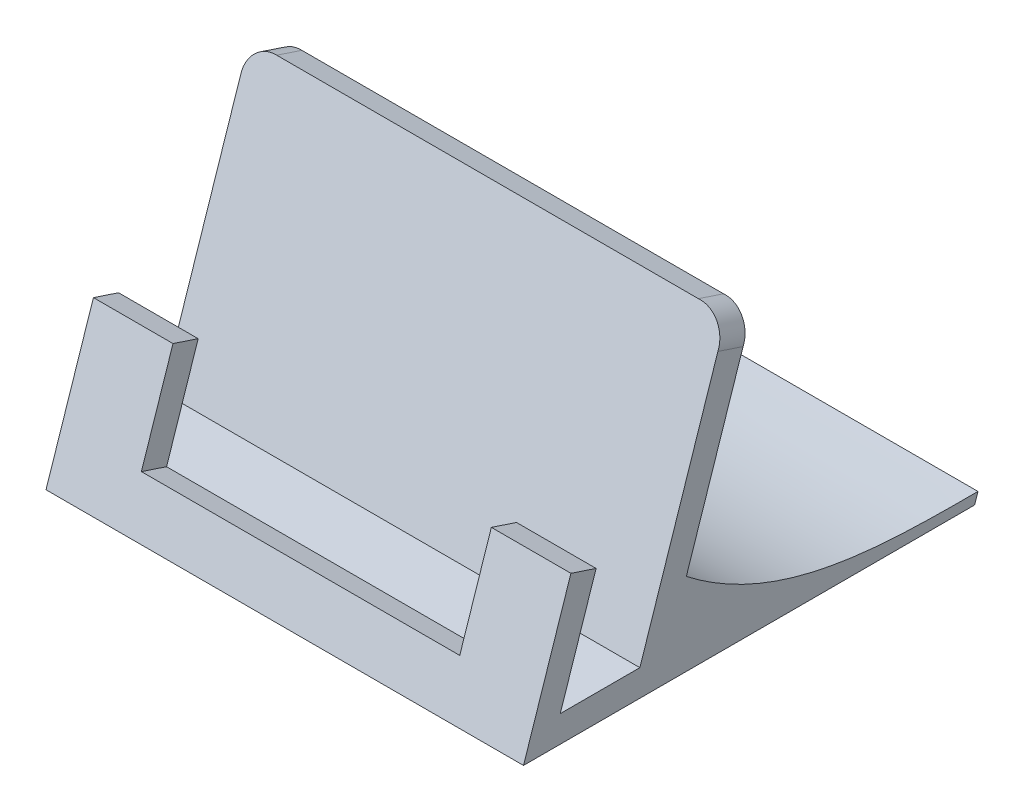
ISO-10303-21;
HEADER;
FILE_DESCRIPTION(('STEP AP214'),'2;1');
FILE_NAME('part.step','',(''),(''),'','','');
FILE_SCHEMA(('AUTOMOTIVE_DESIGN { 1 0 10303 214 1 1 1 1 }'));
ENDSEC;
DATA;
#1=APPLICATION_CONTEXT('core data for automotive mechanical design processes');
#2=APPLICATION_PROTOCOL_DEFINITION('international standard','automotive_design',2000,#1);
#3=PRODUCT_CONTEXT('',#1,'mechanical');
#4=PRODUCT('Part','Part','',(#3));
#5=PRODUCT_RELATED_PRODUCT_CATEGORY('part','',(#4));
#6=PRODUCT_DEFINITION_FORMATION('','',#4);
#7=PRODUCT_DEFINITION_CONTEXT('part definition',#1,'design');
#8=PRODUCT_DEFINITION('design','',#6,#7);
#9=PRODUCT_DEFINITION_SHAPE('','',#8);
#10=(LENGTH_UNIT() NAMED_UNIT(*) SI_UNIT(.MILLI.,.METRE.));
#11=(NAMED_UNIT(*) PLANE_ANGLE_UNIT() SI_UNIT($,.RADIAN.));
#12=(NAMED_UNIT(*) SI_UNIT($,.STERADIAN.) SOLID_ANGLE_UNIT());
#13=UNCERTAINTY_MEASURE_WITH_UNIT(LENGTH_MEASURE(1.E-05),#10,'distance_accuracy_value','');
#14=(GEOMETRIC_REPRESENTATION_CONTEXT(3) GLOBAL_UNCERTAINTY_ASSIGNED_CONTEXT((#13)) GLOBAL_UNIT_ASSIGNED_CONTEXT((#10,
#11,#12)) REPRESENTATION_CONTEXT('',''));
#15=CARTESIAN_POINT('',(0.,0.,0.));
#16=DIRECTION('',(0.,0.,1.));
#17=DIRECTION('',(1.,0.,0.));
#18=AXIS2_PLACEMENT_3D('',#15,#16,#17);
#19=CARTESIAN_POINT('',(-441.444866920152,25.,349.733840304183));
#20=DIRECTION('',(1.,0.,0.));
#21=DIRECTION('',(0.,0.,-1.));
#22=AXIS2_PLACEMENT_3D('',#19,#20,#21);
#23=PLANE('',#22);
#24=DIRECTION('',(0.,3.42548369672828E-06,-0.999999999994133));
#25=VECTOR('',#24,1.);
#26=CARTESIAN_POINT('',(-441.444866920152,3.10228056000864,349.733765293902));
#27=LINE('',#26,#25);
#28=CARTESIAN_POINT('',(-441.444866920152,3.10199384400964,433.434645048575));
#29=VERTEX_POINT('',#28);
#30=CARTESIAN_POINT('',(-441.444866920152,3.10204522573535,418.43479969466));
#31=VERTEX_POINT('',#30);
#32=EDGE_CURVE('E217',#29,#31,#27,.T.);
#33=ORIENTED_EDGE('',*,*,#32,.T.);
#34=DIRECTION('',(0.,-0.948977387132326,0.315344127440966));
#35=VECTOR('',#34,1.);
#36=CARTESIAN_POINT('',(-441.444866920152,5.,417.804111439778));
#37=LINE('',#36,#35);
#38=CARTESIAN_POINT('',(-441.444866920152,47.556984794626,403.662472852231));
#39=VERTEX_POINT('',#38);
#40=EDGE_CURVE('E317',#39,#31,#37,.T.);
#41=ORIENTED_EDGE('',*,*,#40,.F.);
#42=DIRECTION('',(0.,0.315344127440966,0.948977387132325));
#43=VECTOR('',#42,1.);
#44=CARTESIAN_POINT('',(-441.444866920152,45.9802641574228,398.917585916569));
#45=LINE('',#44,#43);
#46=CARTESIAN_POINT('',(-441.444866920152,45.9802641574211,398.91758591657));
#47=VERTEX_POINT('',#46);
#48=EDGE_CURVE('E418',#39,#47,#45,.F.);
#49=ORIENTED_EDGE('',*,*,#48,.T.);
#50=DIRECTION('',(0.,0.948977387132325,-0.315344127440966));
#51=VECTOR('',#50,1.);
#52=CARTESIAN_POINT('',(-441.444866920152,50.8721487194115,397.292018132068));
#53=LINE('',#52,#51);
#54=CARTESIAN_POINT('',(-441.444866920152,13.6122713544121,409.673433828104));
#55=VERTEX_POINT('',#54);
#56=EDGE_CURVE('E312',#55,#47,#53,.T.);
#57=ORIENTED_EDGE('',*,*,#56,.F.);
#58=CARTESIAN_POINT('',(-441.444866920152,0.,352.286663655326));
#59=CARTESIAN_POINT('',(-441.444866920152,0.00659214130960388,371.968229932027));
#60=CARTESIAN_POINT('',(-441.444866920152,-0.348112277879768,391.693864933798));
#61=CARTESIAN_POINT('',(-441.444866920152,13.6122713544121,409.673433828104));
#62=B_SPLINE_CURVE_WITH_KNOTS('',3,(#58,#59,#60,#61),.UNSPECIFIED.,.F.,.F.,(4,4),(0.,1.),.UNSPECIFIED.);
#63=CARTESIAN_POINT('',(-441.444866920152,0.,354.703637066143));
#64=VERTEX_POINT('',#63);
#65=EDGE_CURVE('E221',#64,#55,#62,.T.);
#66=ORIENTED_EDGE('',*,*,#65,.F.);
#67=DIRECTION('',(0.,-0.949003077995214,0.315266804398449));
#68=VECTOR('',#67,1.);
#69=CARTESIAN_POINT('',(-441.444866920152,106.123485976628,319.448522439799));
#70=LINE('',#69,#68);
#71=CARTESIAN_POINT('',(-441.444866920152,-1.89800615599041,355.33417067494));
#72=VERTEX_POINT('',#71);
#73=EDGE_CURVE('E197',#64,#72,#70,.T.);
#74=ORIENTED_EDGE('',*,*,#73,.T.);
#75=DIRECTION('',(0.,0.,-1.));
#76=VECTOR('',#75,1.);
#77=CARTESIAN_POINT('',(-441.444866920152,-1.89800615599041,0.));
#78=LINE('',#77,#76);
#79=CARTESIAN_POINT('',(-441.444866920152,-1.89800615599042,440.36437391298));
#80=VERTEX_POINT('',#79);
#81=EDGE_CURVE('E193',#80,#72,#78,.T.);
#82=ORIENTED_EDGE('',*,*,#81,.F.);
#83=DIRECTION('',(0.,0.949003077995214,-0.315266804398451));
#84=VECTOR('',#83,1.);
#85=CARTESIAN_POINT('',(-441.444866920152,49.4421961498557,423.308726894082));
#86=LINE('',#85,#84);
#87=CARTESIAN_POINT('',(-441.444866920152,25.,431.428630033831));
#88=VERTEX_POINT('',#87);
#89=EDGE_CURVE('E174',#80,#88,#86,.T.);
#90=ORIENTED_EDGE('',*,*,#89,.T.);
#91=DIRECTION('',(0.,-0.31526680439844,-0.949003077995217));
#92=VECTOR('',#91,1.);
#93=CARTESIAN_POINT('',(-441.444866920152,0.557803850145012,357.853743443932));
#94=LINE('',#93,#92);
#95=CARTESIAN_POINT('',(-441.444866920152,23.4236659780078,426.683614643855));
#96=VERTEX_POINT('',#95);
#97=EDGE_CURVE('E187',#88,#96,#94,.T.);
#98=ORIENTED_EDGE('',*,*,#97,.T.);
#99=DIRECTION('',(0.,-0.949003077995217,0.315266804398439));
#100=VECTOR('',#99,1.);
#101=CARTESIAN_POINT('',(-441.444866920152,47.8658621278627,418.563711504106));
#102=LINE('',#101,#100);
#103=EDGE_CURVE('E322',#96,#29,#102,.T.);
#104=ORIENTED_EDGE('',*,*,#103,.T.);
#105=EDGE_LOOP('',(#33,#41,#49,#57,#66,#74,#82,#90,#98,#104));
#106=FACE_BOUND('',#105,.T.);
#107=ADVANCED_FACE('F36',(#106),#23,.F.);
#108=CARTESIAN_POINT('',(-351.444866920152,25.,349.733840304183));
#109=DIRECTION('',(-1.,0.,0.));
#110=DIRECTION('',(0.,0.,1.));
#111=AXIS2_PLACEMENT_3D('',#108,#109,#110);
#112=PLANE('',#111);
#113=DIRECTION('',(0.,-0.948977387132326,0.315344127440966));
#114=VECTOR('',#113,1.);
#115=CARTESIAN_POINT('',(-351.444866920152,5.,417.804111439778));
#116=LINE('',#115,#114);
#117=CARTESIAN_POINT('',(-351.444866920152,47.358446185361,403.728447010679));
#118=VERTEX_POINT('',#117);
#119=CARTESIAN_POINT('',(-351.444866920152,3.10204522573535,418.43479969466));
#120=VERTEX_POINT('',#119);
#121=EDGE_CURVE('E308',#118,#120,#116,.T.);
#122=ORIENTED_EDGE('',*,*,#121,.T.);
#123=DIRECTION('',(0.,3.42548369672828E-06,-0.999999999994133));
#124=VECTOR('',#123,1.);
#125=CARTESIAN_POINT('',(-351.444866920152,3.10204522573535,418.43479969466));
#126=LINE('',#125,#124);
#127=CARTESIAN_POINT('',(-351.444866920152,3.10199384400964,433.434645048575));
#128=VERTEX_POINT('',#127);
#129=EDGE_CURVE('E209',#128,#120,#126,.T.);
#130=ORIENTED_EDGE('',*,*,#129,.F.);
#131=DIRECTION('',(0.,-0.949003077995217,0.315266804398439));
#132=VECTOR('',#131,1.);
#133=CARTESIAN_POINT('',(-351.444866920152,5.,432.804111439778));
#134=LINE('',#133,#132);
#135=CARTESIAN_POINT('',(-351.444866920152,23.4236659780078,426.683614643855));
#136=VERTEX_POINT('',#135);
#137=EDGE_CURVE('E324',#136,#128,#134,.T.);
#138=ORIENTED_EDGE('',*,*,#137,.F.);
#139=DIRECTION('',(0.,-0.31526680439844,-0.949003077995217));
#140=VECTOR('',#139,1.);
#141=CARTESIAN_POINT('',(-351.444866920152,25.,431.428630033831));
#142=LINE('',#141,#140);
#143=CARTESIAN_POINT('',(-351.444866920152,25.,431.428630033831));
#144=VERTEX_POINT('',#143);
#145=EDGE_CURVE('E331',#144,#136,#142,.T.);
#146=ORIENTED_EDGE('',*,*,#145,.F.);
#147=DIRECTION('',(0.,0.949003077995213,-0.315266804398451));
#148=VECTOR('',#147,1.);
#149=CARTESIAN_POINT('',(-351.444866920152,0.,439.733840304183));
#150=LINE('',#149,#148);
#151=CARTESIAN_POINT('',(-351.444866920152,-1.89800615599042,440.36437391298));
#152=VERTEX_POINT('',#151);
#153=EDGE_CURVE('E334',#152,#144,#150,.T.);
#154=ORIENTED_EDGE('',*,*,#153,.F.);
#155=DIRECTION('',(0.,0.,-1.));
#156=VECTOR('',#155,1.);
#157=CARTESIAN_POINT('',(-351.444866920152,-1.89800615599041,0.));
#158=LINE('',#157,#156);
#159=CARTESIAN_POINT('',(-351.444866920152,-1.89800615599041,355.33417067494));
#160=VERTEX_POINT('',#159);
#161=EDGE_CURVE('E195',#152,#160,#158,.T.);
#162=ORIENTED_EDGE('',*,*,#161,.T.);
#163=DIRECTION('',(0.,-0.949003077995214,0.315266804398449));
#164=VECTOR('',#163,1.);
#165=CARTESIAN_POINT('',(-351.444866920152,106.123485976628,319.448522439799));
#166=LINE('',#165,#164);
#167=CARTESIAN_POINT('',(-351.444866920152,0.,354.703637066143));
#168=VERTEX_POINT('',#167);
#169=EDGE_CURVE('E202',#168,#160,#166,.T.);
#170=ORIENTED_EDGE('',*,*,#169,.F.);
#171=CARTESIAN_POINT('',(-351.444866920152,0.,352.286663655326));
#172=CARTESIAN_POINT('',(-351.444866920152,0.00659214130960388,371.968229932027));
#173=CARTESIAN_POINT('',(-351.444866920152,-0.348112277879768,391.693864933798));
#174=CARTESIAN_POINT('',(-351.444866920152,13.6122713544121,409.673433828104));
#175=B_SPLINE_CURVE_WITH_KNOTS('',3,(#171,#172,#173,#174),.UNSPECIFIED.,.F.,.F.,(4,4),(0.,1.),.UNSPECIFIED.);
#176=CARTESIAN_POINT('',(-351.444866920152,13.6122713544121,409.673433828104));
#177=VERTEX_POINT('',#176);
#178=EDGE_CURVE('E434',#168,#177,#175,.T.);
#179=ORIENTED_EDGE('',*,*,#178,.T.);
#180=DIRECTION('',(0.,0.948977387132325,-0.315344127440966));
#181=VECTOR('',#180,1.);
#182=CARTESIAN_POINT('',(-351.444866920152,50.8721487194115,397.292018132068));
#183=LINE('',#182,#181);
#184=CARTESIAN_POINT('',(-351.444866920152,45.7817255481562,398.983560075017));
#185=VERTEX_POINT('',#184);
#186=EDGE_CURVE('E313',#177,#185,#183,.T.);
#187=ORIENTED_EDGE('',*,*,#186,.T.);
#188=DIRECTION('',(0.,0.315344127440966,0.948977387132325));
#189=VECTOR('',#188,1.);
#190=CARTESIAN_POINT('',(-351.444866920152,45.7817255481562,398.983560075017));
#191=LINE('',#190,#189);
#192=EDGE_CURVE('E51',#185,#118,#191,.T.);
#193=ORIENTED_EDGE('',*,*,#192,.T.);
#194=EDGE_LOOP('',(#122,#130,#138,#146,#154,#162,#170,#179,#187,#193));
#195=FACE_BOUND('',#194,.T.);
#196=ADVANCED_FACE('F300',(#195),#112,.F.);
#197=CARTESIAN_POINT('',(-465.444866920152,25.,431.428630033831));
#198=DIRECTION('',(0.,-0.949003077995217,0.31526680439844));
#199=DIRECTION('',(0.,-0.31526680439844,-0.949003077995217));
#200=AXIS2_PLACEMENT_3D('',#197,#198,#199);
#201=PLANE('',#200);
#202=DIRECTION('',(0.,0.315266804398451,0.949003077995214));
#203=VECTOR('',#202,1.);
#204=CARTESIAN_POINT('',(-366.444866920152,22.7931323692108,424.785608487865));
#205=LINE('',#204,#203);
#206=CARTESIAN_POINT('',(-366.444866920152,23.4236659780077,426.683614643855));
#207=VERTEX_POINT('',#206);
#208=CARTESIAN_POINT('',(-366.444866920152,25.,431.428630033831));
#209=VERTEX_POINT('',#208);
#210=EDGE_CURVE('E374',#207,#209,#205,.T.);
#211=ORIENTED_EDGE('',*,*,#210,.T.);
#212=DIRECTION('',(1.,0.,0.));
#213=VECTOR('',#212,1.);
#214=CARTESIAN_POINT('',(-465.444866920152,25.,431.428630033831));
#215=LINE('',#214,#213);
#216=EDGE_CURVE('E330',#209,#144,#215,.T.);
#217=ORIENTED_EDGE('',*,*,#216,.T.);
#218=ORIENTED_EDGE('',*,*,#145,.T.);
#219=DIRECTION('',(1.,0.,0.));
#220=VECTOR('',#219,1.);
#221=CARTESIAN_POINT('',(-465.444866920152,23.4236659780078,426.683614643855));
#222=LINE('',#221,#220);
#223=EDGE_CURVE('E327',#207,#136,#222,.T.);
#224=ORIENTED_EDGE('',*,*,#223,.F.);
#225=EDGE_LOOP('',(#211,#217,#218,#224));
#226=FACE_BOUND('',#225,.T.);
#227=ADVANCED_FACE('F298',(#226),#201,.F.);
#228=CARTESIAN_POINT('',(-465.444866920152,0.,439.733840304183));
#229=DIRECTION('',(0.,-0.315266804398451,-0.949003077995213));
#230=DIRECTION('',(0.,0.949003077995213,-0.315266804398451));
#231=AXIS2_PLACEMENT_3D('',#228,#229,#230);
#232=PLANE('',#231);
#233=DIRECTION('',(-1.,0.,0.));
#234=VECTOR('',#233,1.);
#235=CARTESIAN_POINT('',(-1.27409095702096E-13,7.07598732368962,437.38313780044));
#236=LINE('',#235,#234);
#237=CARTESIAN_POINT('',(-366.444866920152,7.07598732368955,437.383137800439));
#238=VERTEX_POINT('',#237);
#239=CARTESIAN_POINT('',(-426.444866920152,7.07598732368956,437.383137800439));
#240=VERTEX_POINT('',#239);
#241=EDGE_CURVE('E400',#238,#240,#236,.T.);
#242=ORIENTED_EDGE('',*,*,#241,.T.);
#243=DIRECTION('',(0.,-0.949003077995213,0.315266804398451));
#244=VECTOR('',#243,1.);
#245=CARTESIAN_POINT('',(-426.444866920152,25.,431.428630033831));
#246=LINE('',#245,#244);
#247=CARTESIAN_POINT('',(-426.444866920152,25.,431.428630033831));
#248=VERTEX_POINT('',#247);
#249=EDGE_CURVE('E372',#248,#240,#246,.T.);
#250=ORIENTED_EDGE('',*,*,#249,.F.);
#251=EDGE_CURVE('E183',#88,#248,#215,.T.);
#252=ORIENTED_EDGE('',*,*,#251,.F.);
#253=ORIENTED_EDGE('',*,*,#89,.F.);
#254=DIRECTION('',(1.,0.,0.));
#255=VECTOR('',#254,1.);
#256=CARTESIAN_POINT('',(-441.444866920152,-1.89800615599042,440.36437391298));
#257=LINE('',#256,#255);
#258=EDGE_CURVE('E179',#80,#152,#257,.T.);
#259=ORIENTED_EDGE('',*,*,#258,.T.);
#260=ORIENTED_EDGE('',*,*,#153,.T.);
#261=ORIENTED_EDGE('',*,*,#216,.F.);
#262=DIRECTION('',(0.,-0.949003077995213,0.315266804398451));
#263=VECTOR('',#262,1.);
#264=CARTESIAN_POINT('',(-366.444866920152,25.,431.428630033831));
#265=LINE('',#264,#263);
#266=EDGE_CURVE('E367',#209,#238,#265,.T.);
#267=ORIENTED_EDGE('',*,*,#266,.T.);
#268=EDGE_LOOP('',(#242,#250,#252,#253,#259,#260,#261,#267));
#269=FACE_BOUND('',#268,.T.);
#270=ADVANCED_FACE('F177',(#269),#232,.F.);
#271=CARTESIAN_POINT('',(-465.444866920152,5.,432.804111439778));
#272=DIRECTION('',(0.,0.315266804398439,0.949003077995217));
#273=DIRECTION('',(0.,-0.949003077995217,0.315266804398439));
#274=AXIS2_PLACEMENT_3D('',#271,#272,#273);
#275=PLANE('',#274);
#276=ORIENTED_EDGE('',*,*,#137,.T.);
#277=DIRECTION('',(1.,0.,0.));
#278=VECTOR('',#277,1.);
#279=CARTESIAN_POINT('',(-461.444866920152,3.10199384400964,433.434645048575));
#280=LINE('',#279,#278);
#281=EDGE_CURVE('E213',#29,#128,#280,.T.);
#282=ORIENTED_EDGE('',*,*,#281,.F.);
#283=ORIENTED_EDGE('',*,*,#103,.F.);
#284=CARTESIAN_POINT('',(-426.444866920152,23.4236659780077,426.683614643855));
#285=VERTEX_POINT('',#284);
#286=EDGE_CURVE('E188',#96,#285,#222,.T.);
#287=ORIENTED_EDGE('',*,*,#286,.T.);
#288=DIRECTION('',(0.,-0.949003077995217,0.315266804398439));
#289=VECTOR('',#288,1.);
#290=CARTESIAN_POINT('',(-426.444866920152,5.,432.804111439778));
#291=LINE('',#290,#289);
#292=CARTESIAN_POINT('',(-426.444866920152,5.49965330169725,432.638122410463));
#293=VERTEX_POINT('',#292);
#294=EDGE_CURVE('E382',#285,#293,#291,.T.);
#295=ORIENTED_EDGE('',*,*,#294,.T.);
#296=DIRECTION('',(1.,0.,0.));
#297=VECTOR('',#296,1.);
#298=CARTESIAN_POINT('',(-1.27409095702096E-13,5.49965330169725,432.638122410463));
#299=LINE('',#298,#297);
#300=CARTESIAN_POINT('',(-366.444866920152,5.49965330169725,432.638122410463));
#301=VERTEX_POINT('',#300);
#302=EDGE_CURVE('E11',#293,#301,#299,.T.);
#303=ORIENTED_EDGE('',*,*,#302,.T.);
#304=DIRECTION('',(0.,-0.949003077995217,0.315266804398439));
#305=VECTOR('',#304,1.);
#306=CARTESIAN_POINT('',(-366.444866920152,5.,432.804111439778));
#307=LINE('',#306,#305);
#308=EDGE_CURVE('E384',#207,#301,#307,.T.);
#309=ORIENTED_EDGE('',*,*,#308,.F.);
#310=ORIENTED_EDGE('',*,*,#223,.T.);
#311=EDGE_LOOP('',(#276,#282,#283,#287,#295,#303,#309,#310));
#312=FACE_BOUND('',#311,.T.);
#313=ADVANCED_FACE('F291',(#312),#275,.F.);
#314=ORIENTED_EDGE('',*,*,#251,.T.);
#315=DIRECTION('',(0.,0.315266804398451,0.949003077995214));
#316=VECTOR('',#315,1.);
#317=CARTESIAN_POINT('',(-426.444866920152,22.7931323692108,424.785608487865));
#318=LINE('',#317,#316);
#319=EDGE_CURVE('E380',#285,#248,#318,.T.);
#320=ORIENTED_EDGE('',*,*,#319,.F.);
#321=ORIENTED_EDGE('',*,*,#286,.F.);
#322=ORIENTED_EDGE('',*,*,#97,.F.);
#323=EDGE_LOOP('',(#314,#320,#321,#322));
#324=FACE_BOUND('',#323,.T.);
#325=ADVANCED_FACE('F284',(#324),#201,.F.);
#326=CARTESIAN_POINT('',(-441.444866920152,5.,417.804111439778));
#327=DIRECTION('',(0.,0.315344127440966,0.948977387132325));
#328=DIRECTION('',(0.,-0.948977387132326,0.315344127440966));
#329=AXIS2_PLACEMENT_3D('',#326,#327,#328);
#330=PLANE('',#329);
#331=ORIENTED_EDGE('',*,*,#40,.T.);
#332=DIRECTION('',(1.,0.,0.));
#333=VECTOR('',#332,1.);
#334=CARTESIAN_POINT('',(-461.444866920152,3.10204522573535,418.43479969466));
#335=LINE('',#334,#333);
#336=EDGE_CURVE('E214',#31,#120,#335,.T.);
#337=ORIENTED_EDGE('',*,*,#336,.T.);
#338=ORIENTED_EDGE('',*,*,#121,.F.);
#339=CARTESIAN_POINT('',(-356.444866920152,47.7039824209547,403.613625704935));
#340=DIRECTION('',(0.,0.315344127440966,0.948977387132325));
#341=DIRECTION('',(0.,-0.948977387132325,0.315344127440966));
#342=AXIS2_PLACEMENT_3D('',#339,#340,#341);
#343=CIRCLE('',#342,5.01324039143957);
#344=CARTESIAN_POINT('',(-356.808981218637,52.4488693566163,402.03690506773));
#345=VERTEX_POINT('',#344);
#346=EDGE_CURVE('E432',#118,#345,#343,.T.);
#347=ORIENTED_EDGE('',*,*,#346,.T.);
#348=DIRECTION('',(1.,0.,0.));
#349=VECTOR('',#348,1.);
#350=CARTESIAN_POINT('',(-441.444866920152,52.4488693566163,402.03690506773));
#351=LINE('',#350,#349);
#352=CARTESIAN_POINT('',(-436.28996583576,52.4488693566163,402.03690506773));
#353=VERTEX_POINT('',#352);
#354=EDGE_CURVE('E59',#353,#345,#351,.T.);
#355=ORIENTED_EDGE('',*,*,#354,.F.);
#356=CARTESIAN_POINT('',(-436.444866920152,47.7039824209547,403.613625704935));
#357=DIRECTION('',(0.,0.315344127440966,0.948977387132325));
#358=DIRECTION('',(0.,-0.948977387132325,0.315344127440966));
#359=AXIS2_PLACEMENT_3D('',#356,#357,#358);
#360=CIRCLE('',#359,5.00239885914202);
#361=EDGE_CURVE('E424',#353,#39,#360,.T.);
#362=ORIENTED_EDGE('',*,*,#361,.T.);
#363=EDGE_LOOP('',(#331,#337,#338,#347,#355,#362));
#364=FACE_BOUND('',#363,.T.);
#365=ADVANCED_FACE('F280',(#364),#330,.T.);
#366=CARTESIAN_POINT('',(-441.444866920152,52.4488693566163,402.03690506773));
#367=DIRECTION('',(0.,0.948977387132325,-0.315344127440967));
#368=DIRECTION('',(0.,0.315344127440967,0.948977387132325));
#369=AXIS2_PLACEMENT_3D('',#366,#367,#368);
#370=PLANE('',#369);
#371=DIRECTION('',(0.,0.315344127440966,0.948977387132325));
#372=VECTOR('',#371,1.);
#373=CARTESIAN_POINT('',(-356.808981218637,50.8721487194115,397.292018132068));
#374=LINE('',#373,#372);
#375=CARTESIAN_POINT('',(-356.808981218637,50.8721487194115,397.292018132068));
#376=VERTEX_POINT('',#375);
#377=EDGE_CURVE('E429',#376,#345,#374,.T.);
#378=ORIENTED_EDGE('',*,*,#377,.F.);
#379=DIRECTION('',(1.,0.,0.));
#380=VECTOR('',#379,1.);
#381=CARTESIAN_POINT('',(-441.444866920152,50.8721487194115,397.292018132068));
#382=LINE('',#381,#380);
#383=CARTESIAN_POINT('',(-436.28996583576,50.8721487194115,397.292018132068));
#384=VERTEX_POINT('',#383);
#385=EDGE_CURVE('E389',#384,#376,#382,.T.);
#386=ORIENTED_EDGE('',*,*,#385,.F.);
#387=DIRECTION('',(0.,0.315344127440966,0.948977387132325));
#388=VECTOR('',#387,1.);
#389=CARTESIAN_POINT('',(-436.28996583576,50.8721487194115,397.292018132068));
#390=LINE('',#389,#388);
#391=EDGE_CURVE('E420',#353,#384,#390,.F.);
#392=ORIENTED_EDGE('',*,*,#391,.F.);
#393=ORIENTED_EDGE('',*,*,#354,.T.);
#394=EDGE_LOOP('',(#378,#386,#392,#393));
#395=FACE_BOUND('',#394,.T.);
#396=ADVANCED_FACE('F283',(#395),#370,.T.);
#397=CARTESIAN_POINT('',(-441.444866920152,50.8721487194115,397.292018132068));
#398=DIRECTION('',(0.,-0.315344127440966,-0.948977387132325));
#399=DIRECTION('',(0.,0.948977387132326,-0.315344127440966));
#400=AXIS2_PLACEMENT_3D('',#397,#398,#399);
#401=PLANE('',#400);
#402=ORIENTED_EDGE('',*,*,#385,.T.);
#403=CARTESIAN_POINT('',(-356.444866920152,46.1272617837499,398.868738769273));
#404=DIRECTION('',(0.,0.315344127440966,0.948977387132325));
#405=DIRECTION('',(0.,-0.948977387132325,0.315344127440966));
#406=AXIS2_PLACEMENT_3D('',#403,#404,#405);
#407=CIRCLE('',#406,5.01324039143957);
#408=EDGE_CURVE('E431',#185,#376,#407,.T.);
#409=ORIENTED_EDGE('',*,*,#408,.F.);
#410=ORIENTED_EDGE('',*,*,#186,.F.);
#411=DIRECTION('',(-1.,0.,0.));
#412=VECTOR('',#411,1.);
#413=CARTESIAN_POINT('',(-336.444866920152,13.6122713544121,409.673433828104));
#414=LINE('',#413,#412);
#415=EDGE_CURVE('E412',#177,#55,#414,.T.);
#416=ORIENTED_EDGE('',*,*,#415,.T.);
#417=ORIENTED_EDGE('',*,*,#56,.T.);
#418=CARTESIAN_POINT('',(-436.444866920152,46.1272617837499,398.868738769273));
#419=DIRECTION('',(0.,0.315344127440966,0.948977387132325));
#420=DIRECTION('',(0.,-0.948977387132325,0.315344127440966));
#421=AXIS2_PLACEMENT_3D('',#418,#419,#420);
#422=CIRCLE('',#421,5.00239885914202);
#423=EDGE_CURVE('E423',#384,#47,#422,.T.);
#424=ORIENTED_EDGE('',*,*,#423,.F.);
#425=EDGE_LOOP('',(#402,#409,#410,#416,#417,#424));
#426=FACE_BOUND('',#425,.T.);
#427=ADVANCED_FACE('F278',(#426),#401,.T.);
#428=CARTESIAN_POINT('',(-366.444866920152,22.7931323692108,424.785608487865));
#429=DIRECTION('',(-1.,0.,0.));
#430=DIRECTION('',(0.,0.,1.));
#431=AXIS2_PLACEMENT_3D('',#428,#429,#430);
#432=PLANE('',#431);
#433=DIRECTION('',(0.,0.315266804398451,0.949003077995213));
#434=VECTOR('',#433,1.);
#435=CARTESIAN_POINT('',(-366.444866920152,5.18438649729887,431.689119332468));
#436=LINE('',#435,#434);
#437=EDGE_CURVE('E399',#301,#238,#436,.T.);
#438=ORIENTED_EDGE('',*,*,#437,.T.);
#439=ORIENTED_EDGE('',*,*,#266,.F.);
#440=ORIENTED_EDGE('',*,*,#210,.F.);
#441=ORIENTED_EDGE('',*,*,#308,.T.);
#442=EDGE_LOOP('',(#438,#439,#440,#441));
#443=FACE_BOUND('',#442,.T.);
#444=ADVANCED_FACE('F274',(#443),#432,.T.);
#445=CARTESIAN_POINT('',(-426.444866920152,22.7931323692108,424.785608487865));
#446=DIRECTION('',(-1.,0.,0.));
#447=DIRECTION('',(0.,0.,1.));
#448=AXIS2_PLACEMENT_3D('',#445,#446,#447);
#449=PLANE('',#448);
#450=ORIENTED_EDGE('',*,*,#249,.T.);
#451=DIRECTION('',(0.,0.315266804398451,0.949003077995213));
#452=VECTOR('',#451,1.);
#453=CARTESIAN_POINT('',(-426.444866920152,5.18438649729887,431.689119332468));
#454=LINE('',#453,#452);
#455=EDGE_CURVE('E401',#293,#240,#454,.T.);
#456=ORIENTED_EDGE('',*,*,#455,.F.);
#457=ORIENTED_EDGE('',*,*,#294,.F.);
#458=ORIENTED_EDGE('',*,*,#319,.T.);
#459=EDGE_LOOP('',(#450,#456,#457,#458));
#460=FACE_BOUND('',#459,.T.);
#461=ADVANCED_FACE('F257',(#460),#449,.F.);
#462=CARTESIAN_POINT('',(-1.27409095702096E-13,5.18438649729893,431.689119332468));
#463=DIRECTION('',(0.,0.949003077995213,-0.315266804398451));
#464=DIRECTION('',(0.,0.315266804398451,0.949003077995214));
#465=AXIS2_PLACEMENT_3D('',#462,#463,#464);
#466=PLANE('',#465);
#467=ORIENTED_EDGE('',*,*,#302,.F.);
#468=ORIENTED_EDGE('',*,*,#455,.T.);
#469=ORIENTED_EDGE('',*,*,#241,.F.);
#470=ORIENTED_EDGE('',*,*,#437,.F.);
#471=EDGE_LOOP('',(#467,#468,#469,#470));
#472=FACE_BOUND('',#471,.T.);
#473=ADVANCED_FACE('F247',(#472),#466,.T.);
#474=CARTESIAN_POINT('',(-436.444866920152,46.1272617837499,398.868738769273));
#475=DIRECTION('',(0.,0.315344127440966,0.948977387132325));
#476=DIRECTION('',(0.,-0.948977387132325,0.315344127440966));
#477=AXIS2_PLACEMENT_3D('',#474,#475,#476);
#478=CYLINDRICAL_SURFACE('',#477,5.00239885914202);
#479=ORIENTED_EDGE('',*,*,#48,.F.);
#480=ORIENTED_EDGE('',*,*,#361,.F.);
#481=ORIENTED_EDGE('',*,*,#391,.T.);
#482=ORIENTED_EDGE('',*,*,#423,.T.);
#483=EDGE_LOOP('',(#479,#480,#481,#482));
#484=FACE_BOUND('',#483,.T.);
#485=ADVANCED_FACE('F243',(#484),#478,.T.);
#486=CARTESIAN_POINT('',(-356.444866920152,46.1272617837499,398.868738769273));
#487=DIRECTION('',(0.,0.315344127440966,0.948977387132325));
#488=DIRECTION('',(0.,-0.948977387132325,0.315344127440966));
#489=AXIS2_PLACEMENT_3D('',#486,#487,#488);
#490=CYLINDRICAL_SURFACE('',#489,5.01324039143957);
#491=ORIENTED_EDGE('',*,*,#192,.F.);
#492=ORIENTED_EDGE('',*,*,#408,.T.);
#493=ORIENTED_EDGE('',*,*,#377,.T.);
#494=ORIENTED_EDGE('',*,*,#346,.F.);
#495=EDGE_LOOP('',(#491,#492,#493,#494));
#496=FACE_BOUND('',#495,.T.);
#497=ADVANCED_FACE('F238',(#496),#490,.T.);
#498=CARTESIAN_POINT('',(-331.444866920152,0.,352.286663655326));
#499=CARTESIAN_POINT('',(-331.444866920152,0.00659214130960388,371.968229932027));
#500=CARTESIAN_POINT('',(-331.444866920152,-0.348112277879768,391.693864933798));
#501=CARTESIAN_POINT('',(-331.444866920152,13.6122713544121,409.673433828104));
#502=B_SPLINE_CURVE_WITH_KNOTS('',3,(#498,#499,#500,#501),.UNSPECIFIED.,.F.,.F.,(4,4),(0.,1.),.UNSPECIFIED.);
#503=DIRECTION('',(-1.,0.,0.));
#504=VECTOR('',#503,1.);
#505=SURFACE_OF_LINEAR_EXTRUSION('',#502,#504);
#506=DIRECTION('',(1.,0.,0.));
#507=VECTOR('',#506,1.);
#508=CARTESIAN_POINT('',(-456.444866920152,0.,354.703637066143));
#509=LINE('',#508,#507);
#510=EDGE_CURVE('E416',#64,#168,#509,.T.);
#511=ORIENTED_EDGE('',*,*,#510,.F.);
#512=ORIENTED_EDGE('',*,*,#65,.T.);
#513=ORIENTED_EDGE('',*,*,#415,.F.);
#514=ORIENTED_EDGE('',*,*,#178,.F.);
#515=EDGE_LOOP('',(#511,#512,#513,#514));
#516=FACE_BOUND('',#515,.T.);
#517=ADVANCED_FACE('F233',(#516),#505,.F.);
#518=CARTESIAN_POINT('',(-461.444866920152,3.10204522573535,418.43479969466));
#519=DIRECTION('',(0.,-0.999999999994133,-3.42548369672828E-06));
#520=DIRECTION('',(0.,3.42548369672828E-06,-0.999999999994133));
#521=AXIS2_PLACEMENT_3D('',#518,#519,#520);
#522=PLANE('',#521);
#523=ORIENTED_EDGE('',*,*,#281,.T.);
#524=ORIENTED_EDGE('',*,*,#129,.T.);
#525=ORIENTED_EDGE('',*,*,#336,.F.);
#526=ORIENTED_EDGE('',*,*,#32,.F.);
#527=EDGE_LOOP('',(#523,#524,#525,#526));
#528=FACE_BOUND('',#527,.T.);
#529=ADVANCED_FACE('F237',(#528),#522,.F.);
#530=CARTESIAN_POINT('',(-441.444866920152,106.123485976628,319.448522439799));
#531=DIRECTION('',(0.,0.315266804398449,0.949003077995214));
#532=DIRECTION('',(0.,-0.949003077995214,0.315266804398449));
#533=AXIS2_PLACEMENT_3D('',#530,#531,#532);
#534=PLANE('',#533);
#535=ORIENTED_EDGE('',*,*,#169,.T.);
#536=DIRECTION('',(1.,0.,0.));
#537=VECTOR('',#536,1.);
#538=CARTESIAN_POINT('',(-441.444866920152,-1.89800615599041,355.33417067494));
#539=LINE('',#538,#537);
#540=EDGE_CURVE('E196',#72,#160,#539,.T.);
#541=ORIENTED_EDGE('',*,*,#540,.F.);
#542=ORIENTED_EDGE('',*,*,#73,.F.);
#543=ORIENTED_EDGE('',*,*,#510,.T.);
#544=EDGE_LOOP('',(#535,#541,#542,#543));
#545=FACE_BOUND('',#544,.T.);
#546=ADVANCED_FACE('F453',(#545),#534,.F.);
#547=CARTESIAN_POINT('',(-441.444866920152,-1.89800615599041,0.));
#548=DIRECTION('',(0.,-1.,0.));
#549=DIRECTION('',(0.,0.,-1.));
#550=AXIS2_PLACEMENT_3D('',#547,#548,#549);
#551=PLANE('',#550);
#552=ORIENTED_EDGE('',*,*,#161,.F.);
#553=ORIENTED_EDGE('',*,*,#258,.F.);
#554=ORIENTED_EDGE('',*,*,#81,.T.);
#555=ORIENTED_EDGE('',*,*,#540,.T.);
#556=EDGE_LOOP('',(#552,#553,#554,#555));
#557=FACE_BOUND('',#556,.T.);
#558=ADVANCED_FACE('F192',(#557),#551,.T.);
#559=CLOSED_SHELL('',(#107,#196,#227,#270,#313,#325,#365,#396,#427,#444,#461,#473,#485,#497,
#517,#529,#546,#558));
#560=CARTESIAN_POINT('',(0.,1.00000000000002,0.));
#561=DIRECTION('',(0.,1.,0.));
#562=DIRECTION('',(0.,0.,1.));
#563=AXIS2_PLACEMENT_3D('',#560,#561,#562);
#564=PLANE('',#563);
#565=DIRECTION('',(1.,0.,0.));
#566=VECTOR('',#565,1.);
#567=CARTESIAN_POINT('',(-1.39329358078945E-13,1.00000000000002,433.079207720968));
#568=LINE('',#567,#566);
#569=CARTESIAN_POINT('',(-426.444866920152,0.999999999999973,433.079207720968));
#570=VERTEX_POINT('',#569);
#571=CARTESIAN_POINT('',(-366.444866920152,1.00000000000001,433.079207720968));
#572=VERTEX_POINT('',#571);
#573=EDGE_CURVE('E352',#570,#572,#568,.T.);
#574=ORIENTED_EDGE('',*,*,#573,.F.);
#575=DIRECTION('',(0.,0.,1.));
#576=VECTOR('',#575,1.);
#577=CARTESIAN_POINT('',(-426.444866920152,1.00000000000002,430.696636715645));
#578=LINE('',#577,#576);
#579=CARTESIAN_POINT('',(-426.444866920152,1.00000000000001,432.025470358901));
#580=VERTEX_POINT('',#579);
#581=EDGE_CURVE('E355',#580,#570,#578,.T.);
#582=ORIENTED_EDGE('',*,*,#581,.F.);
#583=DIRECTION('',(-1.,0.,0.));
#584=VECTOR('',#583,1.);
#585=CARTESIAN_POINT('',(0.,1.00000000000003,432.025470358901));
#586=LINE('',#585,#584);
#587=CARTESIAN_POINT('',(-366.444866920152,1.00000000000001,432.025470358901));
#588=VERTEX_POINT('',#587);
#589=EDGE_CURVE('E354',#588,#580,#586,.T.);
#590=ORIENTED_EDGE('',*,*,#589,.F.);
#591=DIRECTION('',(0.,0.,-1.));
#592=VECTOR('',#591,1.);
#593=CARTESIAN_POINT('',(-366.444866920152,1.00000000000002,437.294437067301));
#594=LINE('',#593,#592);
#595=EDGE_CURVE('E344',#572,#588,#594,.T.);
#596=ORIENTED_EDGE('',*,*,#595,.F.);
#597=EDGE_LOOP('',(#574,#582,#590,#596));
#598=FACE_BOUND('',#597,.T.);
#599=ADVANCED_FACE('F259',(#598),#564,.F.);
#600=CARTESIAN_POINT('',(-1.27409095702096E-13,0.242244214214643,432.277203204282));
#601=DIRECTION('',(0.,-0.949003077995214,0.315266804398451));
#602=DIRECTION('',(0.,-0.315266804398451,-0.949003077995213));
#603=AXIS2_PLACEMENT_3D('',#600,#601,#602);
#604=PLANE('',#603);
#605=DIRECTION('',(-1.,0.,0.));
#606=VECTOR('',#605,1.);
#607=CARTESIAN_POINT('',(-1.27409095702096E-13,0.557511018613096,433.226206282277));
#608=LINE('',#607,#606);
#609=CARTESIAN_POINT('',(-366.444866920152,0.55751101861305,433.226206282277));
#610=VERTEX_POINT('',#609);
#611=CARTESIAN_POINT('',(-426.444866920152,0.55751101861305,433.226206282277));
#612=VERTEX_POINT('',#611);
#613=EDGE_CURVE('E402',#610,#612,#608,.T.);
#614=ORIENTED_EDGE('',*,*,#613,.F.);
#615=DIRECTION('',(0.,0.315266804398451,0.949003077995214));
#616=VECTOR('',#615,1.);
#617=CARTESIAN_POINT('',(-366.444866920152,0.242244214214608,432.277203204282));
#618=LINE('',#617,#616);
#619=CARTESIAN_POINT('',(-366.444866920152,0.242244214214608,432.277203204282));
#620=VERTEX_POINT('',#619);
#621=EDGE_CURVE('E347',#620,#610,#618,.T.);
#622=ORIENTED_EDGE('',*,*,#621,.F.);
#623=DIRECTION('',(1.,0.,0.));
#624=VECTOR('',#623,1.);
#625=CARTESIAN_POINT('',(-1.27409095702096E-13,0.242244214214643,432.277203204282));
#626=LINE('',#625,#624);
#627=CARTESIAN_POINT('',(-426.444866920152,0.242244214214605,432.277203204282));
#628=VERTEX_POINT('',#627);
#629=EDGE_CURVE('E357',#628,#620,#626,.T.);
#630=ORIENTED_EDGE('',*,*,#629,.F.);
#631=DIRECTION('',(0.,0.315266804398451,0.949003077995214));
#632=VECTOR('',#631,1.);
#633=CARTESIAN_POINT('',(-426.444866920152,0.242244214214605,432.277203204282));
#634=LINE('',#633,#632);
#635=EDGE_CURVE('E364',#628,#612,#634,.T.);
#636=ORIENTED_EDGE('',*,*,#635,.T.);
#637=EDGE_LOOP('',(#614,#622,#630,#636));
#638=FACE_BOUND('',#637,.T.);
#639=ADVANCED_FACE('F262',(#638),#604,.F.);
#640=DIRECTION('',(0.,0.949003077995214,-0.315266804398451));
#641=VECTOR('',#640,1.);
#642=CARTESIAN_POINT('',(-426.444866920152,129.672000891817,390.333286788431));
#643=LINE('',#642,#641);
#644=EDGE_CURVE('E405',#612,#570,#643,.T.);
#645=ORIENTED_EDGE('',*,*,#644,.F.);
#646=ORIENTED_EDGE('',*,*,#635,.F.);
#647=DIRECTION('',(0.,-0.949003077995213,0.315266804398451));
#648=VECTOR('',#647,1.);
#649=CARTESIAN_POINT('',(-426.444866920152,22.7931323692108,424.785608487865));
#650=LINE('',#649,#648);
#651=EDGE_CURVE('E371',#580,#628,#650,.T.);
#652=ORIENTED_EDGE('',*,*,#651,.F.);
#653=ORIENTED_EDGE('',*,*,#581,.T.);
#654=EDGE_LOOP('',(#645,#646,#652,#653));
#655=FACE_BOUND('',#654,.T.);
#656=ADVANCED_FACE('F266',(#655),#449,.F.);
#657=ORIENTED_EDGE('',*,*,#621,.T.);
#658=DIRECTION('',(0.,0.949003077995214,-0.315266804398451));
#659=VECTOR('',#658,1.);
#660=CARTESIAN_POINT('',(-366.444866920152,23.1083991736093,425.73461156586));
#661=LINE('',#660,#659);
#662=EDGE_CURVE('E44',#610,#572,#661,.T.);
#663=ORIENTED_EDGE('',*,*,#662,.T.);
#664=ORIENTED_EDGE('',*,*,#595,.T.);
#665=DIRECTION('',(0.,-0.949003077995213,0.315266804398451));
#666=VECTOR('',#665,1.);
#667=CARTESIAN_POINT('',(-366.444866920152,22.7931323692108,424.785608487865));
#668=LINE('',#667,#666);
#669=EDGE_CURVE('E369',#588,#620,#668,.T.);
#670=ORIENTED_EDGE('',*,*,#669,.T.);
#671=EDGE_LOOP('',(#657,#663,#664,#670));
#672=FACE_BOUND('',#671,.T.);
#673=ADVANCED_FACE('F270',(#672),#432,.T.);
#674=CARTESIAN_POINT('',(0.,129.356734087419,389.384283710436));
#675=DIRECTION('',(0.,0.315266804398451,0.949003077995213));
#676=DIRECTION('',(0.,-0.949003077995213,0.315266804398451));
#677=AXIS2_PLACEMENT_3D('',#674,#675,#676);
#678=PLANE('',#677);
#679=ORIENTED_EDGE('',*,*,#669,.F.);
#680=ORIENTED_EDGE('',*,*,#589,.T.);
#681=ORIENTED_EDGE('',*,*,#651,.T.);
#682=ORIENTED_EDGE('',*,*,#629,.T.);
#683=EDGE_LOOP('',(#679,#680,#681,#682));
#684=FACE_BOUND('',#683,.T.);
#685=ADVANCED_FACE('F252',(#684),#678,.T.);
#686=CARTESIAN_POINT('',(-1.27409095702096E-13,129.672000891817,390.333286788431));
#687=DIRECTION('',(0.,0.315266804398451,0.949003077995214));
#688=DIRECTION('',(0.,-0.949003077995214,0.315266804398451));
#689=AXIS2_PLACEMENT_3D('',#686,#687,#688);
#690=PLANE('',#689);
#691=ORIENTED_EDGE('',*,*,#644,.T.);
#692=ORIENTED_EDGE('',*,*,#573,.T.);
#693=ORIENTED_EDGE('',*,*,#662,.F.);
#694=ORIENTED_EDGE('',*,*,#613,.T.);
#695=EDGE_LOOP('',(#691,#692,#693,#694));
#696=FACE_BOUND('',#695,.T.);
#697=ADVANCED_FACE('F249',(#696),#690,.F.);
#698=CLOSED_SHELL('',(#599,#639,#656,#673,#685,#697));
#699=ORIENTED_CLOSED_SHELL('',*,#698,.T.);
#700=BREP_WITH_VOIDS('B2',#559,(#699));
#701=ADVANCED_BREP_SHAPE_REPRESENTATION('',(#18,#700),#14);
#702=SHAPE_DEFINITION_REPRESENTATION(#9,#701);
ENDSEC;
END-ISO-10303-21;
